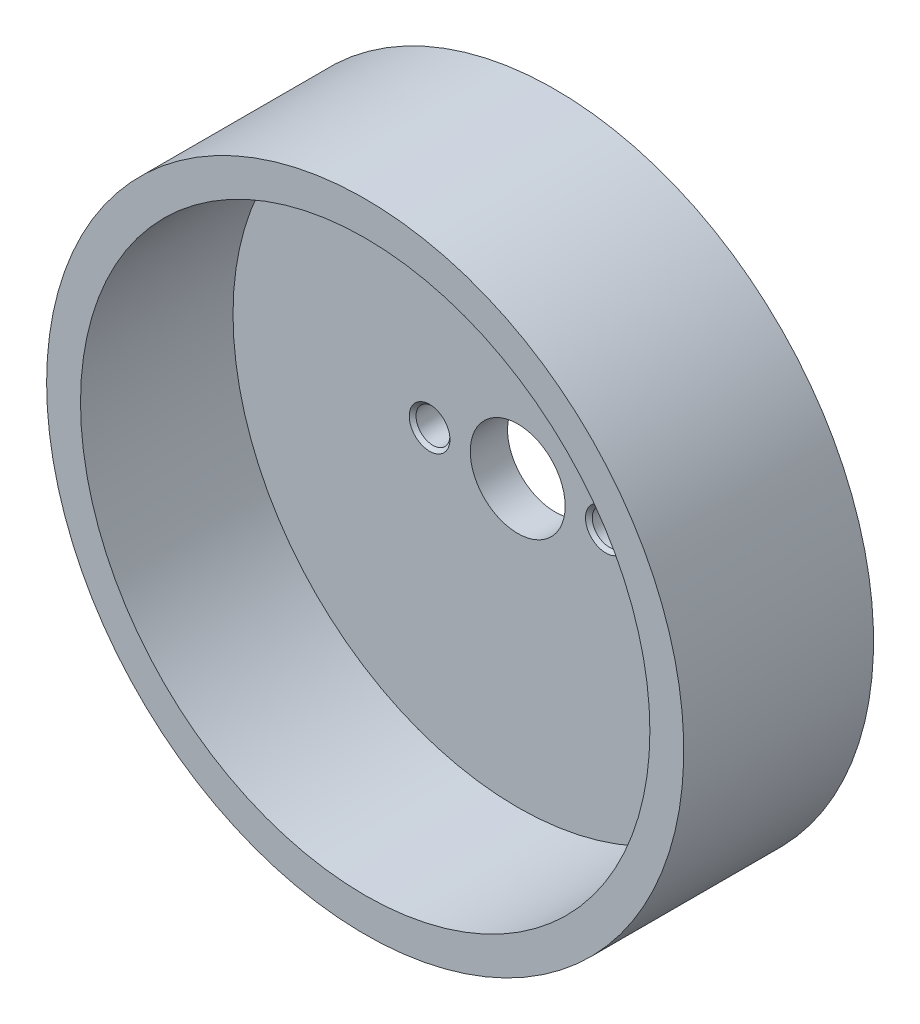
ISO-10303-21;
HEADER;
FILE_DESCRIPTION(('STEP AP214'),'2;1');
FILE_NAME('part.step','',(''),(''),'','','');
FILE_SCHEMA(('AUTOMOTIVE_DESIGN { 1 0 10303 214 1 1 1 1 }'));
ENDSEC;
DATA;
#1=APPLICATION_CONTEXT('core data for automotive mechanical design processes');
#2=APPLICATION_PROTOCOL_DEFINITION('international standard','automotive_design',2000,#1);
#3=PRODUCT_CONTEXT('',#1,'mechanical');
#4=PRODUCT('Part','Part','',(#3));
#5=PRODUCT_RELATED_PRODUCT_CATEGORY('part','',(#4));
#6=PRODUCT_DEFINITION_FORMATION('','',#4);
#7=PRODUCT_DEFINITION_CONTEXT('part definition',#1,'design');
#8=PRODUCT_DEFINITION('design','',#6,#7);
#9=PRODUCT_DEFINITION_SHAPE('','',#8);
#10=(LENGTH_UNIT() NAMED_UNIT(*) SI_UNIT(.MILLI.,.METRE.));
#11=(NAMED_UNIT(*) PLANE_ANGLE_UNIT() SI_UNIT($,.RADIAN.));
#12=(NAMED_UNIT(*) SI_UNIT($,.STERADIAN.) SOLID_ANGLE_UNIT());
#13=UNCERTAINTY_MEASURE_WITH_UNIT(LENGTH_MEASURE(1.E-05),#10,'distance_accuracy_value','');
#14=(GEOMETRIC_REPRESENTATION_CONTEXT(3) GLOBAL_UNCERTAINTY_ASSIGNED_CONTEXT((#13)) GLOBAL_UNIT_ASSIGNED_CONTEXT((#10,
#11,#12)) REPRESENTATION_CONTEXT('',''));
#15=CARTESIAN_POINT('',(0.,0.,0.));
#16=DIRECTION('',(0.,0.,1.));
#17=DIRECTION('',(1.,0.,0.));
#18=AXIS2_PLACEMENT_3D('',#15,#16,#17);
#19=CARTESIAN_POINT('',(6.5,0.,2.74999999999181));
#20=DIRECTION('',(0.,0.,1.));
#21=DIRECTION('',(1.,0.,0.));
#22=AXIS2_PLACEMENT_3D('',#19,#20,#21);
#23=CONICAL_SURFACE('',#22,1.49999999981082,0.78539816260164);
#24=CARTESIAN_POINT('',(6.5,0.,2.74999999999181));
#25=DIRECTION('',(0.,0.,1.));
#26=DIRECTION('',(1.,0.,0.));
#27=AXIS2_PLACEMENT_3D('',#24,#25,#26);
#28=CIRCLE('',#27,1.49999999981082);
#29=CARTESIAN_POINT('',(7.99999999981083,0.,2.74999999999181));
#30=VERTEX_POINT('',#29);
#31=EDGE_CURVE('E17',#30,#30,#28,.T.);
#32=ORIENTED_EDGE('',*,*,#31,.T.);
#33=EDGE_LOOP('',(#32));
#34=FACE_BOUND('',#33,.T.);
#35=CARTESIAN_POINT('',(6.5,0.,2.49999999978036));
#36=DIRECTION('',(0.,0.,1.));
#37=DIRECTION('',(1.,0.,0.));
#38=AXIS2_PLACEMENT_3D('',#35,#36,#37);
#39=CIRCLE('',#38,1.24999999999999);
#40=CARTESIAN_POINT('',(7.74999999999999,0.,2.49999999978036));
#41=VERTEX_POINT('',#40);
#42=EDGE_CURVE('E55',#41,#41,#39,.F.);
#43=ORIENTED_EDGE('',*,*,#42,.T.);
#44=EDGE_LOOP('',(#43));
#45=FACE_BOUND('',#44,.T.);
#46=ADVANCED_FACE('F14',(#34,#45),#23,.F.);
#47=CARTESIAN_POINT('',(-6.5,0.,2.74999999999181));
#48=DIRECTION('',(0.,0.,1.));
#49=DIRECTION('',(1.,0.,0.));
#50=AXIS2_PLACEMENT_3D('',#47,#48,#49);
#51=CONICAL_SURFACE('',#50,1.49999999977717,0.785398162487954);
#52=CARTESIAN_POINT('',(-6.5,0.,2.74999999999181));
#53=DIRECTION('',(0.,0.,1.));
#54=DIRECTION('',(1.,0.,0.));
#55=AXIS2_PLACEMENT_3D('',#52,#53,#54);
#56=CIRCLE('',#55,1.49999999977717);
#57=CARTESIAN_POINT('',(-5.00000000022283,0.,2.74999999999181));
#58=VERTEX_POINT('',#57);
#59=EDGE_CURVE('E50',#58,#58,#56,.T.);
#60=ORIENTED_EDGE('',*,*,#59,.T.);
#61=EDGE_LOOP('',(#60));
#62=FACE_BOUND('',#61,.T.);
#63=CARTESIAN_POINT('',(-6.5,0.,2.49999999978036));
#64=DIRECTION('',(0.,0.,1.));
#65=DIRECTION('',(1.,0.,0.));
#66=AXIS2_PLACEMENT_3D('',#63,#64,#65);
#67=CIRCLE('',#66,1.24999999999999);
#68=CARTESIAN_POINT('',(-5.25000000000001,0.,2.49999999978036));
#69=VERTEX_POINT('',#68);
#70=EDGE_CURVE('E29',#69,#69,#67,.F.);
#71=ORIENTED_EDGE('',*,*,#70,.T.);
#72=EDGE_LOOP('',(#71));
#73=FACE_BOUND('',#72,.T.);
#74=ADVANCED_FACE('F111',(#62,#73),#51,.F.);
#75=CARTESIAN_POINT('',(0.,0.,14.));
#76=DIRECTION('',(0.,0.,1.));
#77=DIRECTION('',(1.,0.,0.));
#78=AXIS2_PLACEMENT_3D('',#75,#76,#77);
#79=CYLINDRICAL_SURFACE('',#78,21.);
#80=CARTESIAN_POINT('',(0.,0.,14.));
#81=DIRECTION('',(0.,0.,1.));
#82=DIRECTION('',(1.,0.,0.));
#83=AXIS2_PLACEMENT_3D('',#80,#81,#82);
#84=CIRCLE('',#83,21.);
#85=CARTESIAN_POINT('',(21.,0.,14.));
#86=VERTEX_POINT('',#85);
#87=EDGE_CURVE('E44',#86,#86,#84,.F.);
#88=ORIENTED_EDGE('',*,*,#87,.F.);
#89=EDGE_LOOP('',(#88));
#90=FACE_BOUND('',#89,.T.);
#91=CARTESIAN_POINT('',(0.,0.,2.75));
#92=DIRECTION('',(0.,0.,1.));
#93=DIRECTION('',(1.,0.,0.));
#94=AXIS2_PLACEMENT_3D('',#91,#92,#93);
#95=CIRCLE('',#94,21.);
#96=CARTESIAN_POINT('',(21.,0.,2.75));
#97=VERTEX_POINT('',#96);
#98=EDGE_CURVE('E48',#97,#97,#95,.F.);
#99=ORIENTED_EDGE('',*,*,#98,.T.);
#100=EDGE_LOOP('',(#99));
#101=FACE_BOUND('',#100,.T.);
#102=ADVANCED_FACE('F108',(#90,#101),#79,.F.);
#103=CARTESIAN_POINT('',(-6.5,0.,2.75));
#104=DIRECTION('',(0.,0.,1.));
#105=DIRECTION('',(1.,0.,0.));
#106=AXIS2_PLACEMENT_3D('',#103,#104,#105);
#107=CYLINDRICAL_SURFACE('',#106,1.24999999999999);
#108=CARTESIAN_POINT('',(-6.5,0.,0.249999999709871));
#109=DIRECTION('',(0.,0.,-1.));
#110=DIRECTION('',(-1.,0.,0.));
#111=AXIS2_PLACEMENT_3D('',#108,#109,#110);
#112=CIRCLE('',#111,1.25000000004411);
#113=CARTESIAN_POINT('',(-7.75000000004411,0.,0.249999999709871));
#114=VERTEX_POINT('',#113);
#115=EDGE_CURVE('E47',#114,#114,#112,.T.);
#116=ORIENTED_EDGE('',*,*,#115,.T.);
#117=EDGE_LOOP('',(#116));
#118=FACE_BOUND('',#117,.T.);
#119=ORIENTED_EDGE('',*,*,#70,.F.);
#120=EDGE_LOOP('',(#119));
#121=FACE_BOUND('',#120,.T.);
#122=ADVANCED_FACE('F105',(#118,#121),#107,.F.);
#123=CARTESIAN_POINT('',(6.5,0.,2.75));
#124=DIRECTION('',(0.,0.,1.));
#125=DIRECTION('',(1.,0.,0.));
#126=AXIS2_PLACEMENT_3D('',#123,#124,#125);
#127=CYLINDRICAL_SURFACE('',#126,1.24999999999999);
#128=CARTESIAN_POINT('',(6.5,0.,0.249999999823558));
#129=DIRECTION('',(0.,0.,-1.));
#130=DIRECTION('',(-1.,0.,0.));
#131=AXIS2_PLACEMENT_3D('',#128,#129,#130);
#132=CIRCLE('',#131,1.25000000001046);
#133=CARTESIAN_POINT('',(5.24999999998954,0.,0.249999999823558));
#134=VERTEX_POINT('',#133);
#135=EDGE_CURVE('E43',#134,#134,#132,.T.);
#136=ORIENTED_EDGE('',*,*,#135,.T.);
#137=EDGE_LOOP('',(#136));
#138=FACE_BOUND('',#137,.T.);
#139=ORIENTED_EDGE('',*,*,#42,.F.);
#140=EDGE_LOOP('',(#139));
#141=FACE_BOUND('',#140,.T.);
#142=ADVANCED_FACE('F68',(#138,#141),#127,.F.);
#143=CARTESIAN_POINT('',(3.50000000000001,0.,2.75));
#144=DIRECTION('',(0.,0.,-1.));
#145=DIRECTION('',(-1.,0.,0.));
#146=AXIS2_PLACEMENT_3D('',#143,#144,#145);
#147=PLANE('',#146);
#148=ORIENTED_EDGE('',*,*,#98,.F.);
#149=EDGE_LOOP('',(#148));
#150=FACE_BOUND('',#149,.T.);
#151=CARTESIAN_POINT('',(0.,0.,2.75));
#152=DIRECTION('',(0.,0.,1.));
#153=DIRECTION('',(1.,0.,0.));
#154=AXIS2_PLACEMENT_3D('',#151,#152,#153);
#155=CIRCLE('',#154,3.50000000000001);
#156=CARTESIAN_POINT('',(3.50000000000001,0.,2.75));
#157=VERTEX_POINT('',#156);
#158=EDGE_CURVE('E40',#157,#157,#155,.F.);
#159=ORIENTED_EDGE('',*,*,#158,.T.);
#160=EDGE_LOOP('',(#159));
#161=FACE_BOUND('',#160,.T.);
#162=ORIENTED_EDGE('',*,*,#59,.F.);
#163=EDGE_LOOP('',(#162));
#164=FACE_BOUND('',#163,.T.);
#165=ORIENTED_EDGE('',*,*,#31,.F.);
#166=EDGE_LOOP('',(#165));
#167=FACE_BOUND('',#166,.T.);
#168=ADVANCED_FACE('F94',(#150,#161,#164,#167),#147,.F.);
#169=CARTESIAN_POINT('',(23.5,0.,14.));
#170=DIRECTION('',(0.,0.,1.));
#171=DIRECTION('',(1.,0.,0.));
#172=AXIS2_PLACEMENT_3D('',#169,#170,#171);
#173=PLANE('',#172);
#174=CARTESIAN_POINT('',(0.,0.,14.));
#175=DIRECTION('',(0.,0.,-1.));
#176=DIRECTION('',(-1.,0.,0.));
#177=AXIS2_PLACEMENT_3D('',#174,#175,#176);
#178=CIRCLE('',#177,23.5);
#179=CARTESIAN_POINT('',(-23.5,0.,14.));
#180=VERTEX_POINT('',#179);
#181=EDGE_CURVE('E37',#180,#180,#178,.T.);
#182=ORIENTED_EDGE('',*,*,#181,.F.);
#183=EDGE_LOOP('',(#182));
#184=FACE_BOUND('',#183,.T.);
#185=ORIENTED_EDGE('',*,*,#87,.T.);
#186=EDGE_LOOP('',(#185));
#187=FACE_BOUND('',#186,.T.);
#188=ADVANCED_FACE('F87',(#184,#187),#173,.T.);
#189=CARTESIAN_POINT('',(-6.5,0.,-1.13686837721616E-10));
#190=DIRECTION('',(0.,0.,-1.));
#191=DIRECTION('',(-1.,0.,0.));
#192=AXIS2_PLACEMENT_3D('',#189,#190,#191);
#193=CONICAL_SURFACE('',#192,1.50000000032242,0.785398164306943);
#194=ORIENTED_EDGE('',*,*,#115,.F.);
#195=EDGE_LOOP('',(#194));
#196=FACE_BOUND('',#195,.T.);
#197=CARTESIAN_POINT('',(-6.5,0.,-4.00183360013112E-11));
#198=DIRECTION('',(0.,0.,-1.));
#199=DIRECTION('',(-1.,0.,0.));
#200=AXIS2_PLACEMENT_3D('',#197,#198,#199);
#201=CIRCLE('',#200,1.50000000024875);
#202=CARTESIAN_POINT('',(-8.00000000024875,0.,-4.00183360013112E-11));
#203=VERTEX_POINT('',#202);
#204=EDGE_CURVE('E34',#203,#203,#201,.F.);
#205=ORIENTED_EDGE('',*,*,#204,.F.);
#206=EDGE_LOOP('',(#205));
#207=FACE_BOUND('',#206,.T.);
#208=ADVANCED_FACE('F75',(#196,#207),#193,.F.);
#209=CARTESIAN_POINT('',(6.5,0.,-5.6843418860808E-11));
#210=DIRECTION('',(0.,0.,-1.));
#211=DIRECTION('',(-1.,0.,0.));
#212=AXIS2_PLACEMENT_3D('',#209,#210,#211);
#213=CONICAL_SURFACE('',#212,1.50000000028877,0.785398164193256);
#214=ORIENTED_EDGE('',*,*,#135,.F.);
#215=EDGE_LOOP('',(#214));
#216=FACE_BOUND('',#215,.T.);
#217=CARTESIAN_POINT('',(6.5,0.,-1.68250830571929E-11));
#218=DIRECTION('',(0.,0.,-1.));
#219=DIRECTION('',(-1.,0.,0.));
#220=AXIS2_PLACEMENT_3D('',#217,#218,#219);
#221=CIRCLE('',#220,1.50000000024875);
#222=CARTESIAN_POINT('',(4.99999999975125,0.,-1.68250830571929E-11));
#223=VERTEX_POINT('',#222);
#224=EDGE_CURVE('E26',#223,#223,#221,.F.);
#225=ORIENTED_EDGE('',*,*,#224,.F.);
#226=EDGE_LOOP('',(#225));
#227=FACE_BOUND('',#226,.T.);
#228=ADVANCED_FACE('F71',(#216,#227),#213,.F.);
#229=CARTESIAN_POINT('',(0.,0.,14.));
#230=DIRECTION('',(0.,0.,1.));
#231=DIRECTION('',(1.,0.,0.));
#232=AXIS2_PLACEMENT_3D('',#229,#230,#231);
#233=CYLINDRICAL_SURFACE('',#232,3.50000000000001);
#234=ORIENTED_EDGE('',*,*,#158,.F.);
#235=EDGE_LOOP('',(#234));
#236=FACE_BOUND('',#235,.T.);
#237=CARTESIAN_POINT('',(0.,0.,0.));
#238=DIRECTION('',(0.,0.,1.));
#239=DIRECTION('',(1.,0.,0.));
#240=AXIS2_PLACEMENT_3D('',#237,#238,#239);
#241=CIRCLE('',#240,3.50000000000001);
#242=CARTESIAN_POINT('',(3.50000000000001,0.,0.));
#243=VERTEX_POINT('',#242);
#244=EDGE_CURVE('E21',#243,#243,#241,.T.);
#245=ORIENTED_EDGE('',*,*,#244,.F.);
#246=EDGE_LOOP('',(#245));
#247=FACE_BOUND('',#246,.T.);
#248=ADVANCED_FACE('F74',(#236,#247),#233,.F.);
#249=CARTESIAN_POINT('',(0.,0.,14.));
#250=DIRECTION('',(0.,0.,-1.));
#251=DIRECTION('',(-1.,0.,0.));
#252=AXIS2_PLACEMENT_3D('',#249,#250,#251);
#253=CYLINDRICAL_SURFACE('',#252,23.5);
#254=ORIENTED_EDGE('',*,*,#181,.T.);
#255=EDGE_LOOP('',(#254));
#256=FACE_BOUND('',#255,.T.);
#257=CARTESIAN_POINT('',(0.,0.,0.));
#258=DIRECTION('',(0.,0.,-1.));
#259=DIRECTION('',(-1.,0.,0.));
#260=AXIS2_PLACEMENT_3D('',#257,#258,#259);
#261=CIRCLE('',#260,23.5);
#262=CARTESIAN_POINT('',(-23.5,0.,0.));
#263=VERTEX_POINT('',#262);
#264=EDGE_CURVE('E10',#263,#263,#261,.T.);
#265=ORIENTED_EDGE('',*,*,#264,.F.);
#266=EDGE_LOOP('',(#265));
#267=FACE_BOUND('',#266,.T.);
#268=ADVANCED_FACE('F82',(#256,#267),#253,.T.);
#269=CARTESIAN_POINT('',(0.,0.,0.));
#270=DIRECTION('',(0.,0.,-1.));
#271=DIRECTION('',(-1.,0.,0.));
#272=AXIS2_PLACEMENT_3D('',#269,#270,#271);
#273=PLANE('',#272);
#274=ORIENTED_EDGE('',*,*,#264,.T.);
#275=EDGE_LOOP('',(#274));
#276=FACE_BOUND('',#275,.T.);
#277=ORIENTED_EDGE('',*,*,#244,.T.);
#278=EDGE_LOOP('',(#277));
#279=FACE_BOUND('',#278,.T.);
#280=ORIENTED_EDGE('',*,*,#224,.T.);
#281=EDGE_LOOP('',(#280));
#282=FACE_BOUND('',#281,.T.);
#283=ORIENTED_EDGE('',*,*,#204,.T.);
#284=EDGE_LOOP('',(#283));
#285=FACE_BOUND('',#284,.T.);
#286=ADVANCED_FACE('F79',(#276,#279,#282,#285),#273,.T.);
#287=CLOSED_SHELL('',(#46,#74,#102,#122,#142,#168,#188,#208,#228,#248,#268,#286));
#288=MANIFOLD_SOLID_BREP('B1',#287);
#289=ADVANCED_BREP_SHAPE_REPRESENTATION('',(#18,#288),#14);
#290=SHAPE_DEFINITION_REPRESENTATION(#9,#289);
ENDSEC;
END-ISO-10303-21;
